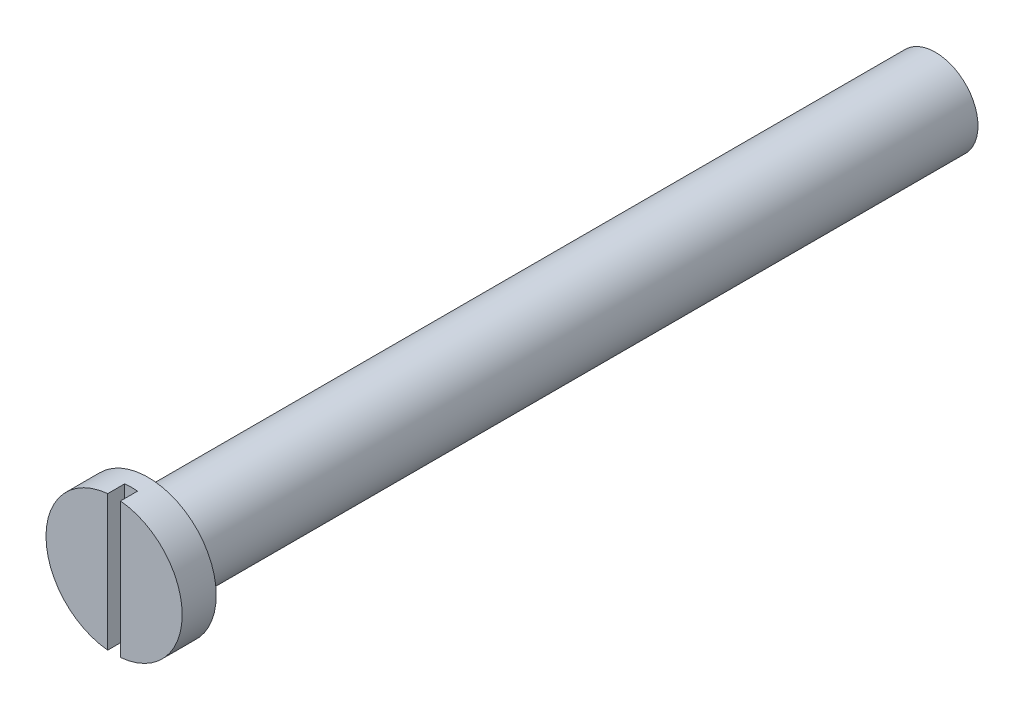
ISO-10303-21;
HEADER;
FILE_DESCRIPTION(('STEP AP214'),'2;1');
FILE_NAME('part.step','',(''),(''),'','','');
FILE_SCHEMA(('AUTOMOTIVE_DESIGN { 1 0 10303 214 1 1 1 1 }'));
ENDSEC;
DATA;
#1=APPLICATION_CONTEXT('core data for automotive mechanical design processes');
#2=APPLICATION_PROTOCOL_DEFINITION('international standard','automotive_design',2000,#1);
#3=PRODUCT_CONTEXT('',#1,'mechanical');
#4=PRODUCT('Part','Part','',(#3));
#5=PRODUCT_RELATED_PRODUCT_CATEGORY('part','',(#4));
#6=PRODUCT_DEFINITION_FORMATION('','',#4);
#7=PRODUCT_DEFINITION_CONTEXT('part definition',#1,'design');
#8=PRODUCT_DEFINITION('design','',#6,#7);
#9=PRODUCT_DEFINITION_SHAPE('','',#8);
#10=(LENGTH_UNIT() NAMED_UNIT(*) SI_UNIT(.MILLI.,.METRE.));
#11=(NAMED_UNIT(*) PLANE_ANGLE_UNIT() SI_UNIT($,.RADIAN.));
#12=(NAMED_UNIT(*) SI_UNIT($,.STERADIAN.) SOLID_ANGLE_UNIT());
#13=UNCERTAINTY_MEASURE_WITH_UNIT(LENGTH_MEASURE(1.E-05),#10,'distance_accuracy_value','');
#14=(GEOMETRIC_REPRESENTATION_CONTEXT(3) GLOBAL_UNCERTAINTY_ASSIGNED_CONTEXT((#13)) GLOBAL_UNIT_ASSIGNED_CONTEXT((#10,
#11,#12)) REPRESENTATION_CONTEXT('',''));
#15=CARTESIAN_POINT('',(0.,0.,0.));
#16=DIRECTION('',(0.,0.,1.));
#17=DIRECTION('',(1.,0.,0.));
#18=AXIS2_PLACEMENT_3D('',#15,#16,#17);
#19=CARTESIAN_POINT('',(0.,0.,96.5));
#20=DIRECTION('',(0.,0.,1.));
#21=DIRECTION('',(1.,0.,0.));
#22=AXIS2_PLACEMENT_3D('',#19,#20,#21);
#23=PLANE('',#22);
#24=DIRECTION('',(0.,1.,0.));
#25=VECTOR('',#24,1.);
#26=CARTESIAN_POINT('',(0.75,0.,96.5));
#27=LINE('',#26,#25);
#28=CARTESIAN_POINT('',(0.75,-7.96476616103699,96.5));
#29=VERTEX_POINT('',#28);
#30=CARTESIAN_POINT('',(0.75,7.964766161037,96.5));
#31=VERTEX_POINT('',#30);
#32=EDGE_CURVE('E124',#29,#31,#27,.T.);
#33=ORIENTED_EDGE('',*,*,#32,.F.);
#34=CARTESIAN_POINT('',(0.,0.,96.5));
#35=DIRECTION('',(0.,0.,1.));
#36=DIRECTION('',(1.,0.,0.));
#37=AXIS2_PLACEMENT_3D('',#34,#35,#36);
#38=CIRCLE('',#37,8.);
#39=EDGE_CURVE('E111',#29,#31,#38,.T.);
#40=ORIENTED_EDGE('',*,*,#39,.T.);
#41=EDGE_LOOP('',(#33,#40));
#42=FACE_BOUND('',#41,.T.);
#43=ADVANCED_FACE('F39',(#42),#23,.T.);
#44=CARTESIAN_POINT('',(0.,0.,92.5));
#45=DIRECTION('',(0.,0.,-1.));
#46=DIRECTION('',(-1.,0.,0.));
#47=AXIS2_PLACEMENT_3D('',#44,#45,#46);
#48=CYLINDRICAL_SURFACE('',#47,5.);
#49=CARTESIAN_POINT('',(0.,0.,92.5));
#50=DIRECTION('',(0.,0.,1.));
#51=DIRECTION('',(1.,0.,0.));
#52=AXIS2_PLACEMENT_3D('',#49,#50,#51);
#53=CIRCLE('',#52,5.);
#54=CARTESIAN_POINT('',(5.,0.,92.5));
#55=VERTEX_POINT('',#54);
#56=EDGE_CURVE('E117',#55,#55,#53,.T.);
#57=ORIENTED_EDGE('',*,*,#56,.F.);
#58=EDGE_LOOP('',(#57));
#59=FACE_BOUND('',#58,.T.);
#60=CARTESIAN_POINT('',(0.,0.,0.));
#61=DIRECTION('',(0.,0.,1.));
#62=DIRECTION('',(1.,0.,0.));
#63=AXIS2_PLACEMENT_3D('',#60,#61,#62);
#64=CIRCLE('',#63,5.);
#65=CARTESIAN_POINT('',(5.,0.,0.));
#66=VERTEX_POINT('',#65);
#67=EDGE_CURVE('E121',#66,#66,#64,.T.);
#68=ORIENTED_EDGE('',*,*,#67,.T.);
#69=EDGE_LOOP('',(#68));
#70=FACE_BOUND('',#69,.T.);
#71=ADVANCED_FACE('F41',(#59,#70),#48,.T.);
#72=CARTESIAN_POINT('',(0.,0.,0.));
#73=DIRECTION('',(0.,0.,1.));
#74=DIRECTION('',(1.,0.,0.));
#75=AXIS2_PLACEMENT_3D('',#72,#73,#74);
#76=PLANE('',#75);
#77=CARTESIAN_POINT('',(0.,0.,0.));
#78=DIRECTION('',(0.,0.,-1.));
#79=DIRECTION('',(-1.,0.,0.));
#80=AXIS2_PLACEMENT_3D('',#77,#78,#79);
#81=CIRCLE('',#80,3.4);
#82=CARTESIAN_POINT('',(-3.4,0.,0.));
#83=VERTEX_POINT('',#82);
#84=EDGE_CURVE('E93',#83,#83,#81,.T.);
#85=ORIENTED_EDGE('',*,*,#84,.F.);
#86=EDGE_LOOP('',(#85));
#87=FACE_BOUND('',#86,.T.);
#88=ORIENTED_EDGE('',*,*,#67,.F.);
#89=EDGE_LOOP('',(#88));
#90=FACE_BOUND('',#89,.T.);
#91=ADVANCED_FACE('F142',(#87,#90),#76,.F.);
#92=CARTESIAN_POINT('',(0.,0.,96.5));
#93=DIRECTION('',(0.,0.,-1.));
#94=DIRECTION('',(-1.,0.,0.));
#95=AXIS2_PLACEMENT_3D('',#92,#93,#94);
#96=CYLINDRICAL_SURFACE('',#95,8.);
#97=CARTESIAN_POINT('',(0.,0.,94.5));
#98=DIRECTION('',(0.,0.,1.));
#99=DIRECTION('',(1.,0.,0.));
#100=AXIS2_PLACEMENT_3D('',#97,#98,#99);
#101=CIRCLE('',#100,8.);
#102=CARTESIAN_POINT('',(0.75,7.964766161037,94.5));
#103=VERTEX_POINT('',#102);
#104=CARTESIAN_POINT('',(-0.75,7.96476616103699,94.5));
#105=VERTEX_POINT('',#104);
#106=EDGE_CURVE('E11',#103,#105,#101,.T.);
#107=ORIENTED_EDGE('',*,*,#106,.F.);
#108=DIRECTION('',(0.,0.,-1.));
#109=VECTOR('',#108,1.);
#110=CARTESIAN_POINT('',(0.75,7.964766161037,96.5));
#111=LINE('',#110,#109);
#112=EDGE_CURVE('E62',#103,#31,#111,.F.);
#113=ORIENTED_EDGE('',*,*,#112,.T.);
#114=ORIENTED_EDGE('',*,*,#39,.F.);
#115=DIRECTION('',(0.,0.,-1.));
#116=VECTOR('',#115,1.);
#117=CARTESIAN_POINT('',(0.75,-7.964766161037,96.5));
#118=LINE('',#117,#116);
#119=CARTESIAN_POINT('',(0.75,-7.964766161037,94.5));
#120=VERTEX_POINT('',#119);
#121=EDGE_CURVE('E107',#29,#120,#118,.T.);
#122=ORIENTED_EDGE('',*,*,#121,.T.);
#123=CARTESIAN_POINT('',(-0.75,-7.96476616103699,94.5));
#124=VERTEX_POINT('',#123);
#125=EDGE_CURVE('E43',#124,#120,#101,.T.);
#126=ORIENTED_EDGE('',*,*,#125,.F.);
#127=DIRECTION('',(0.,0.,-1.));
#128=VECTOR('',#127,1.);
#129=CARTESIAN_POINT('',(-0.75,-7.96476616103699,96.5));
#130=LINE('',#129,#128);
#131=CARTESIAN_POINT('',(-0.75,-7.96476616103699,96.5));
#132=VERTEX_POINT('',#131);
#133=EDGE_CURVE('E102',#124,#132,#130,.F.);
#134=ORIENTED_EDGE('',*,*,#133,.T.);
#135=CARTESIAN_POINT('',(-0.75,7.96476616103699,96.5));
#136=VERTEX_POINT('',#135);
#137=EDGE_CURVE('E114',#136,#132,#38,.T.);
#138=ORIENTED_EDGE('',*,*,#137,.F.);
#139=DIRECTION('',(0.,0.,-1.));
#140=VECTOR('',#139,1.);
#141=CARTESIAN_POINT('',(-0.75,7.96476616103699,96.5));
#142=LINE('',#141,#140);
#143=EDGE_CURVE('E54',#136,#105,#142,.T.);
#144=ORIENTED_EDGE('',*,*,#143,.T.);
#145=EDGE_LOOP('',(#107,#113,#114,#122,#126,#134,#138,#144));
#146=FACE_BOUND('',#145,.T.);
#147=CARTESIAN_POINT('',(0.,0.,92.5));
#148=DIRECTION('',(0.,0.,1.));
#149=DIRECTION('',(1.,0.,0.));
#150=AXIS2_PLACEMENT_3D('',#147,#148,#149);
#151=CIRCLE('',#150,8.);
#152=CARTESIAN_POINT('',(8.,0.,92.5));
#153=VERTEX_POINT('',#152);
#154=EDGE_CURVE('E110',#153,#153,#151,.T.);
#155=ORIENTED_EDGE('',*,*,#154,.T.);
#156=EDGE_LOOP('',(#155));
#157=FACE_BOUND('',#156,.T.);
#158=ADVANCED_FACE('F133',(#146,#157),#96,.T.);
#159=DIRECTION('',(0.,-1.,0.));
#160=VECTOR('',#159,1.);
#161=CARTESIAN_POINT('',(-0.75,0.,96.5));
#162=LINE('',#161,#160);
#163=EDGE_CURVE('E120',#136,#132,#162,.T.);
#164=ORIENTED_EDGE('',*,*,#163,.F.);
#165=ORIENTED_EDGE('',*,*,#137,.T.);
#166=EDGE_LOOP('',(#164,#165));
#167=FACE_BOUND('',#166,.T.);
#168=ADVANCED_FACE('F138',(#167),#23,.T.);
#169=CARTESIAN_POINT('',(0.,0.,92.5));
#170=DIRECTION('',(0.,0.,1.));
#171=DIRECTION('',(1.,0.,0.));
#172=AXIS2_PLACEMENT_3D('',#169,#170,#171);
#173=PLANE('',#172);
#174=ORIENTED_EDGE('',*,*,#56,.T.);
#175=EDGE_LOOP('',(#174));
#176=FACE_BOUND('',#175,.T.);
#177=ORIENTED_EDGE('',*,*,#154,.F.);
#178=EDGE_LOOP('',(#177));
#179=FACE_BOUND('',#178,.T.);
#180=ADVANCED_FACE('F147',(#176,#179),#173,.F.);
#181=CARTESIAN_POINT('',(0.,0.,94.5));
#182=DIRECTION('',(0.,0.,1.));
#183=DIRECTION('',(1.,0.,0.));
#184=AXIS2_PLACEMENT_3D('',#181,#182,#183);
#185=PLANE('',#184);
#186=ORIENTED_EDGE('',*,*,#106,.T.);
#187=DIRECTION('',(0.,-1.,0.));
#188=VECTOR('',#187,1.);
#189=CARTESIAN_POINT('',(-0.75,9.78002511975092,94.5));
#190=LINE('',#189,#188);
#191=EDGE_CURVE('E95',#105,#124,#190,.T.);
#192=ORIENTED_EDGE('',*,*,#191,.T.);
#193=ORIENTED_EDGE('',*,*,#125,.T.);
#194=DIRECTION('',(0.,1.,0.));
#195=VECTOR('',#194,1.);
#196=CARTESIAN_POINT('',(0.75,9.78002511975092,94.5));
#197=LINE('',#196,#195);
#198=EDGE_CURVE('E92',#120,#103,#197,.T.);
#199=ORIENTED_EDGE('',*,*,#198,.T.);
#200=EDGE_LOOP('',(#186,#192,#193,#199));
#201=FACE_BOUND('',#200,.T.);
#202=ADVANCED_FACE('F128',(#201),#185,.T.);
#203=CARTESIAN_POINT('',(0.75,9.78002511975092,94.5));
#204=DIRECTION('',(1.,0.,0.));
#205=DIRECTION('',(0.,0.,-1.));
#206=AXIS2_PLACEMENT_3D('',#203,#204,#205);
#207=PLANE('',#206);
#208=ORIENTED_EDGE('',*,*,#32,.T.);
#209=ORIENTED_EDGE('',*,*,#112,.F.);
#210=ORIENTED_EDGE('',*,*,#198,.F.);
#211=ORIENTED_EDGE('',*,*,#121,.F.);
#212=EDGE_LOOP('',(#208,#209,#210,#211));
#213=FACE_BOUND('',#212,.T.);
#214=ADVANCED_FACE('F131',(#213),#207,.F.);
#215=CARTESIAN_POINT('',(-0.75,9.78002511975092,94.5));
#216=DIRECTION('',(-1.,0.,0.));
#217=DIRECTION('',(0.,0.,1.));
#218=AXIS2_PLACEMENT_3D('',#215,#216,#217);
#219=PLANE('',#218);
#220=ORIENTED_EDGE('',*,*,#163,.T.);
#221=ORIENTED_EDGE('',*,*,#133,.F.);
#222=ORIENTED_EDGE('',*,*,#191,.F.);
#223=ORIENTED_EDGE('',*,*,#143,.F.);
#224=EDGE_LOOP('',(#220,#221,#222,#223));
#225=FACE_BOUND('',#224,.T.);
#226=ADVANCED_FACE('F86',(#225),#219,.F.);
#227=CARTESIAN_POINT('',(0.,0.,15.));
#228=DIRECTION('',(0.,0.,-1.));
#229=DIRECTION('',(-1.,0.,0.));
#230=AXIS2_PLACEMENT_3D('',#227,#228,#229);
#231=CONICAL_SURFACE('',#230,3.39999999999998,1.02974425867665);
#232=CARTESIAN_POINT('',(0.,0.,17.0429261046937));
#233=VERTEX_POINT('',#232);
#234=VERTEX_LOOP('',#233);
#235=FACE_BOUND('',#234,.T.);
#236=CARTESIAN_POINT('',(0.,0.,15.));
#237=DIRECTION('',(0.,0.,-1.));
#238=DIRECTION('',(-1.,0.,0.));
#239=AXIS2_PLACEMENT_3D('',#236,#237,#238);
#240=CIRCLE('',#239,3.39999999999998);
#241=CARTESIAN_POINT('',(-3.39999999999998,0.,15.));
#242=VERTEX_POINT('',#241);
#243=EDGE_CURVE('E90',#242,#242,#240,.T.);
#244=ORIENTED_EDGE('',*,*,#243,.T.);
#245=EDGE_LOOP('',(#244));
#246=FACE_BOUND('',#245,.T.);
#247=ADVANCED_FACE('F82',(#235,#246),#231,.F.);
#248=CARTESIAN_POINT('',(0.,0.,0.));
#249=DIRECTION('',(0.,0.,-1.));
#250=DIRECTION('',(-1.,0.,0.));
#251=AXIS2_PLACEMENT_3D('',#248,#249,#250);
#252=CYLINDRICAL_SURFACE('',#251,3.39999999999999);
#253=ORIENTED_EDGE('',*,*,#243,.F.);
#254=EDGE_LOOP('',(#253));
#255=FACE_BOUND('',#254,.T.);
#256=ORIENTED_EDGE('',*,*,#84,.T.);
#257=EDGE_LOOP('',(#256));
#258=FACE_BOUND('',#257,.T.);
#259=ADVANCED_FACE('F85',(#255,#258),#252,.F.);
#260=CLOSED_SHELL('',(#43,#71,#91,#158,#168,#180,#202,#214,#226,#247,#259));
#261=MANIFOLD_SOLID_BREP('B2',#260);
#262=ADVANCED_BREP_SHAPE_REPRESENTATION('',(#18,#261),#14);
#263=SHAPE_DEFINITION_REPRESENTATION(#9,#262);
ENDSEC;
END-ISO-10303-21;
